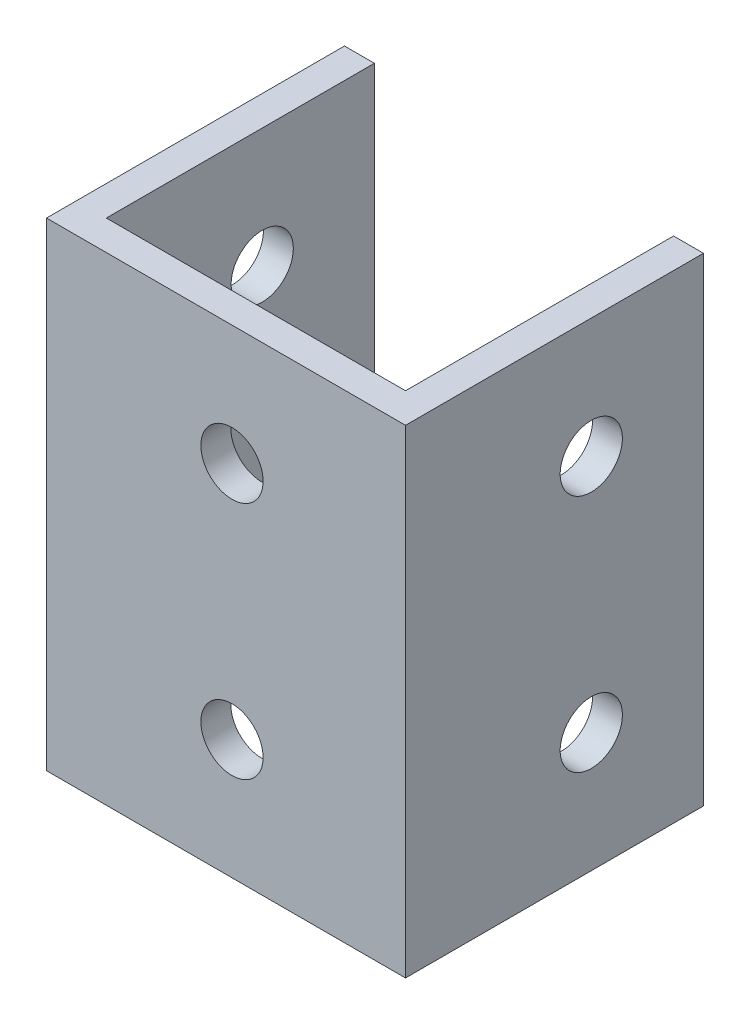
ISO-10303-21;
HEADER;
FILE_DESCRIPTION(('STEP AP214'),'2;1');
FILE_NAME('part.step','',(''),(''),'','','');
FILE_SCHEMA(('AUTOMOTIVE_DESIGN { 1 0 10303 214 1 1 1 1 }'));
ENDSEC;
DATA;
#1=APPLICATION_CONTEXT('core data for automotive mechanical design processes');
#2=APPLICATION_PROTOCOL_DEFINITION('international standard','automotive_design',2000,#1);
#3=PRODUCT_CONTEXT('',#1,'mechanical');
#4=PRODUCT('Part','Part','',(#3));
#5=PRODUCT_RELATED_PRODUCT_CATEGORY('part','',(#4));
#6=PRODUCT_DEFINITION_FORMATION('','',#4);
#7=PRODUCT_DEFINITION_CONTEXT('part definition',#1,'design');
#8=PRODUCT_DEFINITION('design','',#6,#7);
#9=PRODUCT_DEFINITION_SHAPE('','',#8);
#10=(LENGTH_UNIT() NAMED_UNIT(*) SI_UNIT(.MILLI.,.METRE.));
#11=(NAMED_UNIT(*) PLANE_ANGLE_UNIT() SI_UNIT($,.RADIAN.));
#12=(NAMED_UNIT(*) SI_UNIT($,.STERADIAN.) SOLID_ANGLE_UNIT());
#13=UNCERTAINTY_MEASURE_WITH_UNIT(LENGTH_MEASURE(1.E-05),#10,'distance_accuracy_value','');
#14=(GEOMETRIC_REPRESENTATION_CONTEXT(3) GLOBAL_UNCERTAINTY_ASSIGNED_CONTEXT((#13)) GLOBAL_UNIT_ASSIGNED_CONTEXT((#10,
#11,#12)) REPRESENTATION_CONTEXT('',''));
#15=CARTESIAN_POINT('',(0.,0.,0.));
#16=DIRECTION('',(0.,0.,1.));
#17=DIRECTION('',(1.,0.,0.));
#18=AXIS2_PLACEMENT_3D('',#15,#16,#17);
#19=CARTESIAN_POINT('',(3.175,50.8,0.));
#20=DIRECTION('',(0.,0.,1.));
#21=DIRECTION('',(1.,0.,0.));
#22=AXIS2_PLACEMENT_3D('',#19,#20,#21);
#23=PLANE('',#22);
#24=DIRECTION('',(-1.,0.,0.));
#25=VECTOR('',#24,1.);
#26=CARTESIAN_POINT('',(3.175,0.,0.));
#27=LINE('',#26,#25);
#28=CARTESIAN_POINT('',(3.175,0.,0.));
#29=VERTEX_POINT('',#28);
#30=CARTESIAN_POINT('',(0.,0.,0.));
#31=VERTEX_POINT('',#30);
#32=EDGE_CURVE('E131',#29,#31,#27,.T.);
#33=ORIENTED_EDGE('',*,*,#32,.T.);
#34=DIRECTION('',(0.,-1.,0.));
#35=VECTOR('',#34,1.);
#36=CARTESIAN_POINT('',(0.,50.8,0.));
#37=LINE('',#36,#35);
#38=CARTESIAN_POINT('',(0.,50.8,0.));
#39=VERTEX_POINT('',#38);
#40=EDGE_CURVE('E11',#39,#31,#37,.T.);
#41=ORIENTED_EDGE('',*,*,#40,.F.);
#42=DIRECTION('',(-1.,0.,0.));
#43=VECTOR('',#42,1.);
#44=CARTESIAN_POINT('',(3.175,50.8,0.));
#45=LINE('',#44,#43);
#46=CARTESIAN_POINT('',(3.175,50.8,0.));
#47=VERTEX_POINT('',#46);
#48=EDGE_CURVE('E146',#47,#39,#45,.T.);
#49=ORIENTED_EDGE('',*,*,#48,.F.);
#50=DIRECTION('',(0.,-1.,0.));
#51=VECTOR('',#50,1.);
#52=CARTESIAN_POINT('',(3.175,50.8,0.));
#53=LINE('',#52,#51);
#54=EDGE_CURVE('E127',#47,#29,#53,.T.);
#55=ORIENTED_EDGE('',*,*,#54,.T.);
#56=EDGE_LOOP('',(#33,#41,#49,#55));
#57=FACE_BOUND('',#56,.T.);
#58=ADVANCED_FACE('F33',(#57),#23,.F.);
#59=CARTESIAN_POINT('',(0.,50.8,0.));
#60=DIRECTION('',(1.,0.,0.));
#61=DIRECTION('',(0.,0.,-1.));
#62=AXIS2_PLACEMENT_3D('',#59,#60,#61);
#63=PLANE('',#62);
#64=CARTESIAN_POINT('',(0.,12.7,11.90625));
#65=DIRECTION('',(1.,0.,0.));
#66=DIRECTION('',(0.,0.,-1.));
#67=AXIS2_PLACEMENT_3D('',#64,#65,#66);
#68=CIRCLE('',#67,3.302);
#69=CARTESIAN_POINT('',(0.,12.7,8.60425));
#70=VERTEX_POINT('',#69);
#71=EDGE_CURVE('E319',#70,#70,#68,.T.);
#72=ORIENTED_EDGE('',*,*,#71,.T.);
#73=EDGE_LOOP('',(#72));
#74=FACE_BOUND('',#73,.T.);
#75=CARTESIAN_POINT('',(0.,38.1,11.90625));
#76=DIRECTION('',(1.,0.,0.));
#77=DIRECTION('',(0.,0.,-1.));
#78=AXIS2_PLACEMENT_3D('',#75,#76,#77);
#79=CIRCLE('',#78,3.302);
#80=CARTESIAN_POINT('',(0.,38.1,8.60425));
#81=VERTEX_POINT('',#80);
#82=EDGE_CURVE('E160',#81,#81,#79,.T.);
#83=ORIENTED_EDGE('',*,*,#82,.T.);
#84=EDGE_LOOP('',(#83));
#85=FACE_BOUND('',#84,.T.);
#86=DIRECTION('',(0.,0.,1.));
#87=VECTOR('',#86,1.);
#88=CARTESIAN_POINT('',(0.,0.,0.));
#89=LINE('',#88,#87);
#90=CARTESIAN_POINT('',(0.,0.,31.623));
#91=VERTEX_POINT('',#90);
#92=EDGE_CURVE('E134',#31,#91,#89,.T.);
#93=ORIENTED_EDGE('',*,*,#92,.T.);
#94=DIRECTION('',(0.,-1.,0.));
#95=VECTOR('',#94,1.);
#96=CARTESIAN_POINT('',(0.,50.8,31.623));
#97=LINE('',#96,#95);
#98=CARTESIAN_POINT('',(0.,50.8,31.623));
#99=VERTEX_POINT('',#98);
#100=EDGE_CURVE('E42',#99,#91,#97,.T.);
#101=ORIENTED_EDGE('',*,*,#100,.F.);
#102=DIRECTION('',(0.,0.,1.));
#103=VECTOR('',#102,1.);
#104=CARTESIAN_POINT('',(0.,50.8,0.));
#105=LINE('',#104,#103);
#106=EDGE_CURVE('E94',#39,#99,#105,.T.);
#107=ORIENTED_EDGE('',*,*,#106,.F.);
#108=ORIENTED_EDGE('',*,*,#40,.T.);
#109=EDGE_LOOP('',(#93,#101,#107,#108));
#110=FACE_BOUND('',#109,.T.);
#111=ADVANCED_FACE('F223',(#74,#85,#110),#63,.F.);
#112=CARTESIAN_POINT('',(0.,50.8,31.623));
#113=DIRECTION('',(0.,0.,-1.));
#114=DIRECTION('',(-1.,0.,0.));
#115=AXIS2_PLACEMENT_3D('',#112,#113,#114);
#116=PLANE('',#115);
#117=CARTESIAN_POINT('',(19.685,38.0911070321901,31.623));
#118=DIRECTION('',(0.,0.,-1.));
#119=DIRECTION('',(-1.,0.,0.));
#120=AXIS2_PLACEMENT_3D('',#117,#118,#119);
#121=CIRCLE('',#120,3.302);
#122=CARTESIAN_POINT('',(16.383,38.0911070321901,31.623));
#123=VERTEX_POINT('',#122);
#124=EDGE_CURVE('E179',#123,#123,#121,.T.);
#125=ORIENTED_EDGE('',*,*,#124,.T.);
#126=EDGE_LOOP('',(#125));
#127=FACE_BOUND('',#126,.T.);
#128=CARTESIAN_POINT('',(19.685,12.7,31.623));
#129=DIRECTION('',(0.,0.,-1.));
#130=DIRECTION('',(-1.,0.,0.));
#131=AXIS2_PLACEMENT_3D('',#128,#129,#130);
#132=CIRCLE('',#131,3.302);
#133=CARTESIAN_POINT('',(16.383,12.7,31.623));
#134=VERTEX_POINT('',#133);
#135=EDGE_CURVE('E135',#134,#134,#132,.T.);
#136=ORIENTED_EDGE('',*,*,#135,.T.);
#137=EDGE_LOOP('',(#136));
#138=FACE_BOUND('',#137,.T.);
#139=DIRECTION('',(1.,0.,0.));
#140=VECTOR('',#139,1.);
#141=CARTESIAN_POINT('',(0.,0.,31.623));
#142=LINE('',#141,#140);
#143=CARTESIAN_POINT('',(38.1,0.,31.623));
#144=VERTEX_POINT('',#143);
#145=EDGE_CURVE('E137',#91,#144,#142,.T.);
#146=ORIENTED_EDGE('',*,*,#145,.T.);
#147=DIRECTION('',(0.,-1.,0.));
#148=VECTOR('',#147,1.);
#149=CARTESIAN_POINT('',(38.1,50.8,31.623));
#150=LINE('',#149,#148);
#151=CARTESIAN_POINT('',(38.1,50.8,31.623));
#152=VERTEX_POINT('',#151);
#153=EDGE_CURVE('E153',#152,#144,#150,.T.);
#154=ORIENTED_EDGE('',*,*,#153,.F.);
#155=DIRECTION('',(1.,0.,0.));
#156=VECTOR('',#155,1.);
#157=CARTESIAN_POINT('',(0.,50.8,31.623));
#158=LINE('',#157,#156);
#159=EDGE_CURVE('E189',#99,#152,#158,.T.);
#160=ORIENTED_EDGE('',*,*,#159,.F.);
#161=ORIENTED_EDGE('',*,*,#100,.T.);
#162=EDGE_LOOP('',(#146,#154,#160,#161));
#163=FACE_BOUND('',#162,.T.);
#164=ADVANCED_FACE('F227',(#127,#138,#163),#116,.F.);
#165=CARTESIAN_POINT('',(38.1,50.8,31.623));
#166=DIRECTION('',(-1.,0.,0.));
#167=DIRECTION('',(0.,0.,1.));
#168=AXIS2_PLACEMENT_3D('',#165,#166,#167);
#169=PLANE('',#168);
#170=CARTESIAN_POINT('',(38.1,12.7,11.90625));
#171=DIRECTION('',(1.,0.,0.));
#172=DIRECTION('',(0.,0.,-1.));
#173=AXIS2_PLACEMENT_3D('',#170,#171,#172);
#174=CIRCLE('',#173,3.302);
#175=CARTESIAN_POINT('',(38.1,12.7,8.60425));
#176=VERTEX_POINT('',#175);
#177=EDGE_CURVE('E318',#176,#176,#174,.T.);
#178=ORIENTED_EDGE('',*,*,#177,.F.);
#179=EDGE_LOOP('',(#178));
#180=FACE_BOUND('',#179,.T.);
#181=CARTESIAN_POINT('',(38.1,38.1,11.90625));
#182=DIRECTION('',(1.,0.,0.));
#183=DIRECTION('',(0.,0.,-1.));
#184=AXIS2_PLACEMENT_3D('',#181,#182,#183);
#185=CIRCLE('',#184,3.302);
#186=CARTESIAN_POINT('',(38.1,38.1,8.60425));
#187=VERTEX_POINT('',#186);
#188=EDGE_CURVE('E167',#187,#187,#185,.T.);
#189=ORIENTED_EDGE('',*,*,#188,.F.);
#190=EDGE_LOOP('',(#189));
#191=FACE_BOUND('',#190,.T.);
#192=DIRECTION('',(0.,0.,-1.));
#193=VECTOR('',#192,1.);
#194=CARTESIAN_POINT('',(38.1,0.,31.623));
#195=LINE('',#194,#193);
#196=CARTESIAN_POINT('',(38.1,0.,0.));
#197=VERTEX_POINT('',#196);
#198=EDGE_CURVE('E139',#144,#197,#195,.T.);
#199=ORIENTED_EDGE('',*,*,#198,.T.);
#200=DIRECTION('',(0.,-1.,0.));
#201=VECTOR('',#200,1.);
#202=CARTESIAN_POINT('',(38.1,50.8,0.));
#203=LINE('',#202,#201);
#204=CARTESIAN_POINT('',(38.1,50.8,0.));
#205=VERTEX_POINT('',#204);
#206=EDGE_CURVE('E150',#205,#197,#203,.T.);
#207=ORIENTED_EDGE('',*,*,#206,.F.);
#208=DIRECTION('',(0.,0.,-1.));
#209=VECTOR('',#208,1.);
#210=CARTESIAN_POINT('',(38.1,50.8,31.623));
#211=LINE('',#210,#209);
#212=EDGE_CURVE('E191',#152,#205,#211,.T.);
#213=ORIENTED_EDGE('',*,*,#212,.F.);
#214=ORIENTED_EDGE('',*,*,#153,.T.);
#215=EDGE_LOOP('',(#199,#207,#213,#214));
#216=FACE_BOUND('',#215,.T.);
#217=ADVANCED_FACE('F197',(#180,#191,#216),#169,.F.);
#218=CARTESIAN_POINT('',(38.1,50.8,0.));
#219=DIRECTION('',(0.,0.,1.));
#220=DIRECTION('',(1.,0.,0.));
#221=AXIS2_PLACEMENT_3D('',#218,#219,#220);
#222=PLANE('',#221);
#223=DIRECTION('',(-1.,0.,0.));
#224=VECTOR('',#223,1.);
#225=CARTESIAN_POINT('',(38.1,0.,0.));
#226=LINE('',#225,#224);
#227=CARTESIAN_POINT('',(34.925,0.,0.));
#228=VERTEX_POINT('',#227);
#229=EDGE_CURVE('E141',#197,#228,#226,.T.);
#230=ORIENTED_EDGE('',*,*,#229,.T.);
#231=DIRECTION('',(0.,-1.,0.));
#232=VECTOR('',#231,1.);
#233=CARTESIAN_POINT('',(34.925,50.8,0.));
#234=LINE('',#233,#232);
#235=CARTESIAN_POINT('',(34.925,50.8,0.));
#236=VERTEX_POINT('',#235);
#237=EDGE_CURVE('E122',#236,#228,#234,.T.);
#238=ORIENTED_EDGE('',*,*,#237,.F.);
#239=DIRECTION('',(-1.,0.,0.));
#240=VECTOR('',#239,1.);
#241=CARTESIAN_POINT('',(38.1,50.8,0.));
#242=LINE('',#241,#240);
#243=EDGE_CURVE('E113',#205,#236,#242,.T.);
#244=ORIENTED_EDGE('',*,*,#243,.F.);
#245=ORIENTED_EDGE('',*,*,#206,.T.);
#246=EDGE_LOOP('',(#230,#238,#244,#245));
#247=FACE_BOUND('',#246,.T.);
#248=ADVANCED_FACE('F201',(#247),#222,.F.);
#249=CARTESIAN_POINT('',(34.925,50.8,0.));
#250=DIRECTION('',(1.,0.,0.));
#251=DIRECTION('',(0.,0.,-1.));
#252=AXIS2_PLACEMENT_3D('',#249,#250,#251);
#253=PLANE('',#252);
#254=CARTESIAN_POINT('',(34.925,12.7,11.90625));
#255=DIRECTION('',(1.,0.,0.));
#256=DIRECTION('',(0.,0.,-1.));
#257=AXIS2_PLACEMENT_3D('',#254,#255,#256);
#258=CIRCLE('',#257,3.302);
#259=CARTESIAN_POINT('',(34.925,12.7,8.60425));
#260=VERTEX_POINT('',#259);
#261=EDGE_CURVE('E172',#260,#260,#258,.T.);
#262=ORIENTED_EDGE('',*,*,#261,.T.);
#263=EDGE_LOOP('',(#262));
#264=FACE_BOUND('',#263,.T.);
#265=CARTESIAN_POINT('',(34.925,38.1,11.90625));
#266=DIRECTION('',(1.,0.,0.));
#267=DIRECTION('',(0.,0.,-1.));
#268=AXIS2_PLACEMENT_3D('',#265,#266,#267);
#269=CIRCLE('',#268,3.302);
#270=CARTESIAN_POINT('',(34.925,38.1,8.60425));
#271=VERTEX_POINT('',#270);
#272=EDGE_CURVE('E159',#271,#271,#269,.T.);
#273=ORIENTED_EDGE('',*,*,#272,.T.);
#274=EDGE_LOOP('',(#273));
#275=FACE_BOUND('',#274,.T.);
#276=DIRECTION('',(0.,0.,1.));
#277=VECTOR('',#276,1.);
#278=CARTESIAN_POINT('',(34.925,0.,0.));
#279=LINE('',#278,#277);
#280=CARTESIAN_POINT('',(34.925,0.,28.448));
#281=VERTEX_POINT('',#280);
#282=EDGE_CURVE('E121',#228,#281,#279,.T.);
#283=ORIENTED_EDGE('',*,*,#282,.T.);
#284=DIRECTION('',(0.,-1.,0.));
#285=VECTOR('',#284,1.);
#286=CARTESIAN_POINT('',(34.925,50.8,28.448));
#287=LINE('',#286,#285);
#288=CARTESIAN_POINT('',(34.925,50.8,28.448));
#289=VERTEX_POINT('',#288);
#290=EDGE_CURVE('E118',#289,#281,#287,.T.);
#291=ORIENTED_EDGE('',*,*,#290,.F.);
#292=DIRECTION('',(0.,0.,1.));
#293=VECTOR('',#292,1.);
#294=CARTESIAN_POINT('',(34.925,50.8,0.));
#295=LINE('',#294,#293);
#296=EDGE_CURVE('E107',#236,#289,#295,.T.);
#297=ORIENTED_EDGE('',*,*,#296,.F.);
#298=ORIENTED_EDGE('',*,*,#237,.T.);
#299=EDGE_LOOP('',(#283,#291,#297,#298));
#300=FACE_BOUND('',#299,.T.);
#301=ADVANCED_FACE('F119',(#264,#275,#300),#253,.F.);
#302=CARTESIAN_POINT('',(34.925,50.8,28.448));
#303=DIRECTION('',(0.,0.,1.));
#304=DIRECTION('',(1.,0.,0.));
#305=AXIS2_PLACEMENT_3D('',#302,#303,#304);
#306=PLANE('',#305);
#307=CARTESIAN_POINT('',(19.685,38.0911070321901,28.448));
#308=DIRECTION('',(0.,0.,-1.));
#309=DIRECTION('',(-1.,0.,0.));
#310=AXIS2_PLACEMENT_3D('',#307,#308,#309);
#311=CIRCLE('',#310,3.302);
#312=CARTESIAN_POINT('',(16.383,38.0911070321901,28.448));
#313=VERTEX_POINT('',#312);
#314=EDGE_CURVE('E164',#313,#313,#311,.T.);
#315=ORIENTED_EDGE('',*,*,#314,.F.);
#316=EDGE_LOOP('',(#315));
#317=FACE_BOUND('',#316,.T.);
#318=CARTESIAN_POINT('',(19.685,12.7,28.448));
#319=DIRECTION('',(0.,0.,-1.));
#320=DIRECTION('',(-1.,0.,0.));
#321=AXIS2_PLACEMENT_3D('',#318,#319,#320);
#322=CIRCLE('',#321,3.302);
#323=CARTESIAN_POINT('',(16.383,12.7,28.448));
#324=VERTEX_POINT('',#323);
#325=EDGE_CURVE('E182',#324,#324,#322,.T.);
#326=ORIENTED_EDGE('',*,*,#325,.F.);
#327=EDGE_LOOP('',(#326));
#328=FACE_BOUND('',#327,.T.);
#329=DIRECTION('',(-1.,0.,0.));
#330=VECTOR('',#329,1.);
#331=CARTESIAN_POINT('',(34.925,0.,28.448));
#332=LINE('',#331,#330);
#333=CARTESIAN_POINT('',(3.175,0.,28.448));
#334=VERTEX_POINT('',#333);
#335=EDGE_CURVE('E80',#281,#334,#332,.T.);
#336=ORIENTED_EDGE('',*,*,#335,.T.);
#337=DIRECTION('',(0.,-1.,0.));
#338=VECTOR('',#337,1.);
#339=CARTESIAN_POINT('',(3.175,50.8,28.448));
#340=LINE('',#339,#338);
#341=CARTESIAN_POINT('',(3.175,50.8,28.448));
#342=VERTEX_POINT('',#341);
#343=EDGE_CURVE('E123',#342,#334,#340,.T.);
#344=ORIENTED_EDGE('',*,*,#343,.F.);
#345=DIRECTION('',(-1.,0.,0.));
#346=VECTOR('',#345,1.);
#347=CARTESIAN_POINT('',(34.925,50.8,28.448));
#348=LINE('',#347,#346);
#349=EDGE_CURVE('E111',#289,#342,#348,.T.);
#350=ORIENTED_EDGE('',*,*,#349,.F.);
#351=ORIENTED_EDGE('',*,*,#290,.T.);
#352=EDGE_LOOP('',(#336,#344,#350,#351));
#353=FACE_BOUND('',#352,.T.);
#354=ADVANCED_FACE('F125',(#317,#328,#353),#306,.F.);
#355=CARTESIAN_POINT('',(3.175,50.8,28.448));
#356=DIRECTION('',(-1.,0.,0.));
#357=DIRECTION('',(0.,0.,1.));
#358=AXIS2_PLACEMENT_3D('',#355,#356,#357);
#359=PLANE('',#358);
#360=CARTESIAN_POINT('',(3.175,12.7,11.90625));
#361=DIRECTION('',(-1.,0.,0.));
#362=DIRECTION('',(0.,0.,1.));
#363=AXIS2_PLACEMENT_3D('',#360,#361,#362);
#364=CIRCLE('',#363,3.302);
#365=CARTESIAN_POINT('',(3.175,12.7,15.20825));
#366=VERTEX_POINT('',#365);
#367=EDGE_CURVE('E36',#366,#366,#364,.T.);
#368=ORIENTED_EDGE('',*,*,#367,.T.);
#369=EDGE_LOOP('',(#368));
#370=FACE_BOUND('',#369,.T.);
#371=CARTESIAN_POINT('',(3.175,38.1,11.90625));
#372=DIRECTION('',(-1.,0.,0.));
#373=DIRECTION('',(0.,0.,1.));
#374=AXIS2_PLACEMENT_3D('',#371,#372,#373);
#375=CIRCLE('',#374,3.302);
#376=CARTESIAN_POINT('',(3.175,38.1,15.20825));
#377=VERTEX_POINT('',#376);
#378=EDGE_CURVE('E157',#377,#377,#375,.T.);
#379=ORIENTED_EDGE('',*,*,#378,.T.);
#380=EDGE_LOOP('',(#379));
#381=FACE_BOUND('',#380,.T.);
#382=DIRECTION('',(0.,0.,-1.));
#383=VECTOR('',#382,1.);
#384=CARTESIAN_POINT('',(3.175,0.,28.448));
#385=LINE('',#384,#383);
#386=EDGE_CURVE('E86',#334,#29,#385,.T.);
#387=ORIENTED_EDGE('',*,*,#386,.T.);
#388=ORIENTED_EDGE('',*,*,#54,.F.);
#389=DIRECTION('',(0.,0.,-1.));
#390=VECTOR('',#389,1.);
#391=CARTESIAN_POINT('',(3.175,50.8,28.448));
#392=LINE('',#391,#390);
#393=EDGE_CURVE('E51',#342,#47,#392,.T.);
#394=ORIENTED_EDGE('',*,*,#393,.F.);
#395=ORIENTED_EDGE('',*,*,#343,.T.);
#396=EDGE_LOOP('',(#387,#388,#394,#395));
#397=FACE_BOUND('',#396,.T.);
#398=ADVANCED_FACE('F209',(#370,#381,#397),#359,.F.);
#399=CARTESIAN_POINT('',(0.,50.8,0.));
#400=DIRECTION('',(0.,1.,0.));
#401=DIRECTION('',(0.,0.,1.));
#402=AXIS2_PLACEMENT_3D('',#399,#400,#401);
#403=PLANE('',#402);
#404=ORIENTED_EDGE('',*,*,#48,.T.);
#405=ORIENTED_EDGE('',*,*,#106,.T.);
#406=ORIENTED_EDGE('',*,*,#159,.T.);
#407=ORIENTED_EDGE('',*,*,#212,.T.);
#408=ORIENTED_EDGE('',*,*,#243,.T.);
#409=ORIENTED_EDGE('',*,*,#296,.T.);
#410=ORIENTED_EDGE('',*,*,#349,.T.);
#411=ORIENTED_EDGE('',*,*,#393,.T.);
#412=EDGE_LOOP('',(#404,#405,#406,#407,#408,#409,#410,#411));
#413=FACE_BOUND('',#412,.T.);
#414=ADVANCED_FACE('F109',(#413),#403,.T.);
#415=CARTESIAN_POINT('',(0.,0.,0.));
#416=DIRECTION('',(0.,1.,0.));
#417=DIRECTION('',(0.,0.,1.));
#418=AXIS2_PLACEMENT_3D('',#415,#416,#417);
#419=PLANE('',#418);
#420=ORIENTED_EDGE('',*,*,#32,.F.);
#421=ORIENTED_EDGE('',*,*,#386,.F.);
#422=ORIENTED_EDGE('',*,*,#335,.F.);
#423=ORIENTED_EDGE('',*,*,#282,.F.);
#424=ORIENTED_EDGE('',*,*,#229,.F.);
#425=ORIENTED_EDGE('',*,*,#198,.F.);
#426=ORIENTED_EDGE('',*,*,#145,.F.);
#427=ORIENTED_EDGE('',*,*,#92,.F.);
#428=EDGE_LOOP('',(#420,#421,#422,#423,#424,#425,#426,#427));
#429=FACE_BOUND('',#428,.T.);
#430=ADVANCED_FACE('F204',(#429),#419,.F.);
#431=CARTESIAN_POINT('',(19.685,12.7,79.248));
#432=DIRECTION('',(0.,0.,-1.));
#433=DIRECTION('',(-1.,0.,0.));
#434=AXIS2_PLACEMENT_3D('',#431,#432,#433);
#435=CYLINDRICAL_SURFACE('',#434,3.302);
#436=ORIENTED_EDGE('',*,*,#325,.T.);
#437=EDGE_LOOP('',(#436));
#438=FACE_BOUND('',#437,.T.);
#439=ORIENTED_EDGE('',*,*,#135,.F.);
#440=EDGE_LOOP('',(#439));
#441=FACE_BOUND('',#440,.T.);
#442=ADVANCED_FACE('F268',(#438,#441),#435,.F.);
#443=CARTESIAN_POINT('',(19.685,38.0911070321901,79.248));
#444=DIRECTION('',(0.,0.,-1.));
#445=DIRECTION('',(-1.,0.,0.));
#446=AXIS2_PLACEMENT_3D('',#443,#444,#445);
#447=CYLINDRICAL_SURFACE('',#446,3.302);
#448=ORIENTED_EDGE('',*,*,#314,.T.);
#449=EDGE_LOOP('',(#448));
#450=FACE_BOUND('',#449,.T.);
#451=ORIENTED_EDGE('',*,*,#124,.F.);
#452=EDGE_LOOP('',(#451));
#453=FACE_BOUND('',#452,.T.);
#454=ADVANCED_FACE('F263',(#450,#453),#447,.F.);
#455=CARTESIAN_POINT('',(0.,38.1,11.90625));
#456=DIRECTION('',(1.,0.,0.));
#457=DIRECTION('',(0.,0.,-1.));
#458=AXIS2_PLACEMENT_3D('',#455,#456,#457);
#459=CYLINDRICAL_SURFACE('',#458,3.302);
#460=ORIENTED_EDGE('',*,*,#82,.F.);
#461=EDGE_LOOP('',(#460));
#462=FACE_BOUND('',#461,.T.);
#463=ORIENTED_EDGE('',*,*,#378,.F.);
#464=EDGE_LOOP('',(#463));
#465=FACE_BOUND('',#464,.T.);
#466=ADVANCED_FACE('F253',(#462,#465),#459,.F.);
#467=ORIENTED_EDGE('',*,*,#188,.T.);
#468=EDGE_LOOP('',(#467));
#469=FACE_BOUND('',#468,.T.);
#470=ORIENTED_EDGE('',*,*,#272,.F.);
#471=EDGE_LOOP('',(#470));
#472=FACE_BOUND('',#471,.T.);
#473=ADVANCED_FACE('F250',(#469,#472),#459,.F.);
#474=CARTESIAN_POINT('',(0.,12.7,11.90625));
#475=DIRECTION('',(1.,0.,0.));
#476=DIRECTION('',(0.,0.,-1.));
#477=AXIS2_PLACEMENT_3D('',#474,#475,#476);
#478=CYLINDRICAL_SURFACE('',#477,3.302);
#479=ORIENTED_EDGE('',*,*,#71,.F.);
#480=EDGE_LOOP('',(#479));
#481=FACE_BOUND('',#480,.T.);
#482=ORIENTED_EDGE('',*,*,#367,.F.);
#483=EDGE_LOOP('',(#482));
#484=FACE_BOUND('',#483,.T.);
#485=ADVANCED_FACE('F252',(#481,#484),#478,.F.);
#486=ORIENTED_EDGE('',*,*,#177,.T.);
#487=EDGE_LOOP('',(#486));
#488=FACE_BOUND('',#487,.T.);
#489=ORIENTED_EDGE('',*,*,#261,.F.);
#490=EDGE_LOOP('',(#489));
#491=FACE_BOUND('',#490,.T.);
#492=ADVANCED_FACE('F260',(#488,#491),#478,.F.);
#493=CLOSED_SHELL('',(#58,#111,#164,#217,#248,#301,#354,#398,#414,#430,#442,#454,#466,#473,#485,#492));
#494=MANIFOLD_SOLID_BREP('B2',#493);
#495=ADVANCED_BREP_SHAPE_REPRESENTATION('',(#18,#494),#14);
#496=SHAPE_DEFINITION_REPRESENTATION(#9,#495);
ENDSEC;
END-ISO-10303-21;
